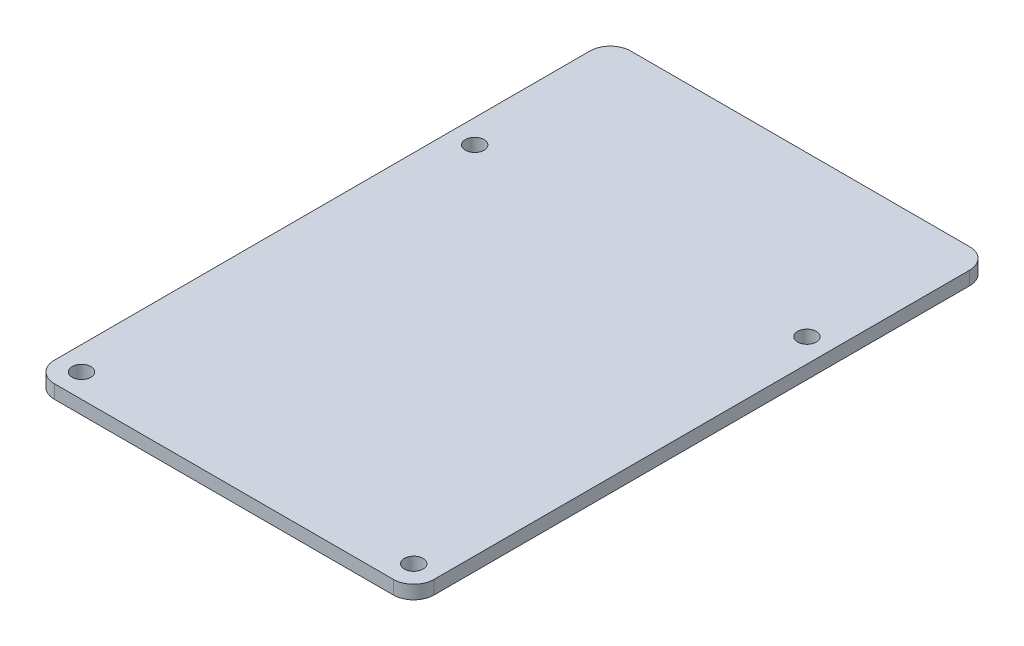
ISO-10303-21;
HEADER;
FILE_DESCRIPTION(('STEP AP214'),'2;1');
FILE_NAME('part.step','',(''),(''),'','','');
FILE_SCHEMA(('AUTOMOTIVE_DESIGN { 1 0 10303 214 1 1 1 1 }'));
ENDSEC;
DATA;
#1=APPLICATION_CONTEXT('core data for automotive mechanical design processes');
#2=APPLICATION_PROTOCOL_DEFINITION('international standard','automotive_design',2000,#1);
#3=PRODUCT_CONTEXT('',#1,'mechanical');
#4=PRODUCT('Part','Part','',(#3));
#5=PRODUCT_RELATED_PRODUCT_CATEGORY('part','',(#4));
#6=PRODUCT_DEFINITION_FORMATION('','',#4);
#7=PRODUCT_DEFINITION_CONTEXT('part definition',#1,'design');
#8=PRODUCT_DEFINITION('design','',#6,#7);
#9=PRODUCT_DEFINITION_SHAPE('','',#8);
#10=(LENGTH_UNIT() NAMED_UNIT(*) SI_UNIT(.MILLI.,.METRE.));
#11=(NAMED_UNIT(*) PLANE_ANGLE_UNIT() SI_UNIT($,.RADIAN.));
#12=(NAMED_UNIT(*) SI_UNIT($,.STERADIAN.) SOLID_ANGLE_UNIT());
#13=UNCERTAINTY_MEASURE_WITH_UNIT(LENGTH_MEASURE(1.E-05),#10,'distance_accuracy_value','');
#14=(GEOMETRIC_REPRESENTATION_CONTEXT(3) GLOBAL_UNCERTAINTY_ASSIGNED_CONTEXT((#13)) GLOBAL_UNIT_ASSIGNED_CONTEXT((#10,
#11,#12)) REPRESENTATION_CONTEXT('',''));
#15=CARTESIAN_POINT('',(0.,0.,0.));
#16=DIRECTION('',(0.,0.,1.));
#17=DIRECTION('',(1.,0.,0.));
#18=AXIS2_PLACEMENT_3D('',#15,#16,#17);
#19=CARTESIAN_POINT('',(0.,2.,0.));
#20=DIRECTION('',(0.,-1.,0.));
#21=DIRECTION('',(0.,0.,-1.));
#22=AXIS2_PLACEMENT_3D('',#19,#20,#21);
#23=PLANE('',#22);
#24=DIRECTION('',(-1.,0.,0.));
#25=VECTOR('',#24,1.);
#26=CARTESIAN_POINT('',(-28.,2.,-42.5));
#27=LINE('',#26,#25);
#28=CARTESIAN_POINT('',(25.,2.,-42.5));
#29=VERTEX_POINT('',#28);
#30=CARTESIAN_POINT('',(-25.,2.,-42.5));
#31=VERTEX_POINT('',#30);
#32=EDGE_CURVE('E169',#29,#31,#27,.T.);
#33=ORIENTED_EDGE('',*,*,#32,.T.);
#34=CARTESIAN_POINT('',(-25.,2.,-39.5));
#35=DIRECTION('',(0.,-1.,0.));
#36=DIRECTION('',(0.,0.,-1.));
#37=AXIS2_PLACEMENT_3D('',#34,#35,#36);
#38=CIRCLE('',#37,3.);
#39=CARTESIAN_POINT('',(-28.,2.,-39.5));
#40=VERTEX_POINT('',#39);
#41=EDGE_CURVE('E147',#31,#40,#38,.F.);
#42=ORIENTED_EDGE('',*,*,#41,.T.);
#43=DIRECTION('',(0.,0.,1.));
#44=VECTOR('',#43,1.);
#45=CARTESIAN_POINT('',(-28.,2.,42.5));
#46=LINE('',#45,#44);
#47=CARTESIAN_POINT('',(-28.,2.,39.5));
#48=VERTEX_POINT('',#47);
#49=EDGE_CURVE('E117',#40,#48,#46,.T.);
#50=ORIENTED_EDGE('',*,*,#49,.T.);
#51=CARTESIAN_POINT('',(-25.,2.,39.5));
#52=DIRECTION('',(0.,-1.,0.));
#53=DIRECTION('',(0.,0.,-1.));
#54=AXIS2_PLACEMENT_3D('',#51,#52,#53);
#55=CIRCLE('',#54,3.);
#56=CARTESIAN_POINT('',(-25.,2.,42.5));
#57=VERTEX_POINT('',#56);
#58=EDGE_CURVE('E53',#48,#57,#55,.F.);
#59=ORIENTED_EDGE('',*,*,#58,.T.);
#60=DIRECTION('',(1.,0.,0.));
#61=VECTOR('',#60,1.);
#62=CARTESIAN_POINT('',(-28.,2.,42.5));
#63=LINE('',#62,#61);
#64=CARTESIAN_POINT('',(25.,2.,42.5));
#65=VERTEX_POINT('',#64);
#66=EDGE_CURVE('E133',#57,#65,#63,.T.);
#67=ORIENTED_EDGE('',*,*,#66,.T.);
#68=CARTESIAN_POINT('',(25.,2.,39.5));
#69=DIRECTION('',(0.,-1.,0.));
#70=DIRECTION('',(0.,0.,-1.));
#71=AXIS2_PLACEMENT_3D('',#68,#69,#70);
#72=CIRCLE('',#71,3.);
#73=CARTESIAN_POINT('',(28.,2.,39.5));
#74=VERTEX_POINT('',#73);
#75=EDGE_CURVE('E143',#65,#74,#72,.F.);
#76=ORIENTED_EDGE('',*,*,#75,.T.);
#77=DIRECTION('',(0.,0.,-1.));
#78=VECTOR('',#77,1.);
#79=CARTESIAN_POINT('',(28.,2.,42.5));
#80=LINE('',#79,#78);
#81=CARTESIAN_POINT('',(28.,2.,-39.5));
#82=VERTEX_POINT('',#81);
#83=EDGE_CURVE('E127',#74,#82,#80,.T.);
#84=ORIENTED_EDGE('',*,*,#83,.T.);
#85=CARTESIAN_POINT('',(25.,2.,-39.5));
#86=DIRECTION('',(0.,-1.,0.));
#87=DIRECTION('',(0.,0.,-1.));
#88=AXIS2_PLACEMENT_3D('',#85,#86,#87);
#89=CIRCLE('',#88,3.);
#90=EDGE_CURVE('E145',#82,#29,#89,.F.);
#91=ORIENTED_EDGE('',*,*,#90,.T.);
#92=EDGE_LOOP('',(#33,#42,#50,#59,#67,#76,#84,#91));
#93=FACE_BOUND('',#92,.T.);
#94=CARTESIAN_POINT('',(-24.5,2.,39.));
#95=DIRECTION('',(0.,1.,0.));
#96=DIRECTION('',(0.,0.,1.));
#97=AXIS2_PLACEMENT_3D('',#94,#95,#96);
#98=CIRCLE('',#97,1.375);
#99=CARTESIAN_POINT('',(-24.5,2.,40.375));
#100=VERTEX_POINT('',#99);
#101=EDGE_CURVE('E178',#100,#100,#98,.T.);
#102=ORIENTED_EDGE('',*,*,#101,.F.);
#103=EDGE_LOOP('',(#102));
#104=FACE_BOUND('',#103,.T.);
#105=CARTESIAN_POINT('',(-24.5,2.,-19.));
#106=DIRECTION('',(0.,1.,0.));
#107=DIRECTION('',(0.,0.,1.));
#108=AXIS2_PLACEMENT_3D('',#105,#106,#107);
#109=CIRCLE('',#108,1.375);
#110=CARTESIAN_POINT('',(-24.5,2.,-17.625));
#111=VERTEX_POINT('',#110);
#112=EDGE_CURVE('E183',#111,#111,#109,.T.);
#113=ORIENTED_EDGE('',*,*,#112,.F.);
#114=EDGE_LOOP('',(#113));
#115=FACE_BOUND('',#114,.T.);
#116=CARTESIAN_POINT('',(24.5,2.,-19.));
#117=DIRECTION('',(0.,1.,0.));
#118=DIRECTION('',(0.,0.,1.));
#119=AXIS2_PLACEMENT_3D('',#116,#117,#118);
#120=CIRCLE('',#119,1.375);
#121=CARTESIAN_POINT('',(24.5,2.,-17.625));
#122=VERTEX_POINT('',#121);
#123=EDGE_CURVE('E188',#122,#122,#120,.T.);
#124=ORIENTED_EDGE('',*,*,#123,.F.);
#125=EDGE_LOOP('',(#124));
#126=FACE_BOUND('',#125,.T.);
#127=CARTESIAN_POINT('',(24.5,2.,39.));
#128=DIRECTION('',(0.,1.,0.));
#129=DIRECTION('',(0.,0.,1.));
#130=AXIS2_PLACEMENT_3D('',#127,#128,#129);
#131=CIRCLE('',#130,1.375);
#132=CARTESIAN_POINT('',(24.5,2.,40.375));
#133=VERTEX_POINT('',#132);
#134=EDGE_CURVE('E194',#133,#133,#131,.T.);
#135=ORIENTED_EDGE('',*,*,#134,.F.);
#136=EDGE_LOOP('',(#135));
#137=FACE_BOUND('',#136,.T.);
#138=ADVANCED_FACE('F33',(#93,#104,#115,#126,#137),#23,.F.);
#139=CARTESIAN_POINT('',(0.,0.,0.));
#140=DIRECTION('',(0.,-1.,0.));
#141=DIRECTION('',(0.,0.,-1.));
#142=AXIS2_PLACEMENT_3D('',#139,#140,#141);
#143=PLANE('',#142);
#144=CARTESIAN_POINT('',(24.5,0.,-19.));
#145=DIRECTION('',(0.,1.,0.));
#146=DIRECTION('',(0.,0.,1.));
#147=AXIS2_PLACEMENT_3D('',#144,#145,#146);
#148=CIRCLE('',#147,1.375);
#149=CARTESIAN_POINT('',(24.5,0.,-17.625));
#150=VERTEX_POINT('',#149);
#151=EDGE_CURVE('E191',#150,#150,#148,.T.);
#152=ORIENTED_EDGE('',*,*,#151,.T.);
#153=EDGE_LOOP('',(#152));
#154=FACE_BOUND('',#153,.T.);
#155=CARTESIAN_POINT('',(-24.5,0.,39.));
#156=DIRECTION('',(0.,1.,0.));
#157=DIRECTION('',(0.,0.,1.));
#158=AXIS2_PLACEMENT_3D('',#155,#156,#157);
#159=CIRCLE('',#158,1.375);
#160=CARTESIAN_POINT('',(-24.5,0.,40.375));
#161=VERTEX_POINT('',#160);
#162=EDGE_CURVE('E174',#161,#161,#159,.T.);
#163=ORIENTED_EDGE('',*,*,#162,.T.);
#164=EDGE_LOOP('',(#163));
#165=FACE_BOUND('',#164,.T.);
#166=DIRECTION('',(0.,0.,1.));
#167=VECTOR('',#166,1.);
#168=CARTESIAN_POINT('',(-28.,0.,42.5));
#169=LINE('',#168,#167);
#170=CARTESIAN_POINT('',(-28.,0.,-39.5));
#171=VERTEX_POINT('',#170);
#172=CARTESIAN_POINT('',(-28.,0.,39.5));
#173=VERTEX_POINT('',#172);
#174=EDGE_CURVE('E115',#171,#173,#169,.T.);
#175=ORIENTED_EDGE('',*,*,#174,.F.);
#176=CARTESIAN_POINT('',(-25.,0.,-39.5));
#177=DIRECTION('',(0.,-1.,0.));
#178=DIRECTION('',(0.,0.,-1.));
#179=AXIS2_PLACEMENT_3D('',#176,#177,#178);
#180=CIRCLE('',#179,3.);
#181=CARTESIAN_POINT('',(-25.,0.,-42.5));
#182=VERTEX_POINT('',#181);
#183=EDGE_CURVE('E98',#171,#182,#180,.T.);
#184=ORIENTED_EDGE('',*,*,#183,.T.);
#185=DIRECTION('',(-1.,0.,0.));
#186=VECTOR('',#185,1.);
#187=CARTESIAN_POINT('',(-28.,0.,-42.5));
#188=LINE('',#187,#186);
#189=CARTESIAN_POINT('',(25.,0.,-42.5));
#190=VERTEX_POINT('',#189);
#191=EDGE_CURVE('E125',#190,#182,#188,.T.);
#192=ORIENTED_EDGE('',*,*,#191,.F.);
#193=CARTESIAN_POINT('',(25.,0.,-39.5));
#194=DIRECTION('',(0.,-1.,0.));
#195=DIRECTION('',(0.,0.,-1.));
#196=AXIS2_PLACEMENT_3D('',#193,#194,#195);
#197=CIRCLE('',#196,3.);
#198=CARTESIAN_POINT('',(28.,0.,-39.5));
#199=VERTEX_POINT('',#198);
#200=EDGE_CURVE('E109',#190,#199,#197,.T.);
#201=ORIENTED_EDGE('',*,*,#200,.T.);
#202=DIRECTION('',(0.,0.,-1.));
#203=VECTOR('',#202,1.);
#204=CARTESIAN_POINT('',(28.,0.,42.5));
#205=LINE('',#204,#203);
#206=CARTESIAN_POINT('',(28.,0.,39.5));
#207=VERTEX_POINT('',#206);
#208=EDGE_CURVE('E129',#207,#199,#205,.T.);
#209=ORIENTED_EDGE('',*,*,#208,.F.);
#210=CARTESIAN_POINT('',(25.,0.,39.5));
#211=DIRECTION('',(0.,-1.,0.));
#212=DIRECTION('',(0.,0.,-1.));
#213=AXIS2_PLACEMENT_3D('',#210,#211,#212);
#214=CIRCLE('',#213,3.);
#215=CARTESIAN_POINT('',(25.,0.,42.5));
#216=VERTEX_POINT('',#215);
#217=EDGE_CURVE('E136',#207,#216,#214,.T.);
#218=ORIENTED_EDGE('',*,*,#217,.T.);
#219=DIRECTION('',(1.,0.,0.));
#220=VECTOR('',#219,1.);
#221=CARTESIAN_POINT('',(-28.,0.,42.5));
#222=LINE('',#221,#220);
#223=CARTESIAN_POINT('',(-25.,0.,42.5));
#224=VERTEX_POINT('',#223);
#225=EDGE_CURVE('E124',#224,#216,#222,.T.);
#226=ORIENTED_EDGE('',*,*,#225,.F.);
#227=CARTESIAN_POINT('',(-25.,0.,39.5));
#228=DIRECTION('',(0.,-1.,0.));
#229=DIRECTION('',(0.,0.,-1.));
#230=AXIS2_PLACEMENT_3D('',#227,#228,#229);
#231=CIRCLE('',#230,3.);
#232=EDGE_CURVE('E118',#224,#173,#231,.T.);
#233=ORIENTED_EDGE('',*,*,#232,.T.);
#234=EDGE_LOOP('',(#175,#184,#192,#201,#209,#218,#226,#233));
#235=FACE_BOUND('',#234,.T.);
#236=CARTESIAN_POINT('',(-24.5,0.,-19.));
#237=DIRECTION('',(0.,1.,0.));
#238=DIRECTION('',(0.,0.,1.));
#239=AXIS2_PLACEMENT_3D('',#236,#237,#238);
#240=CIRCLE('',#239,1.375);
#241=CARTESIAN_POINT('',(-24.5,0.,-17.625));
#242=VERTEX_POINT('',#241);
#243=EDGE_CURVE('E185',#242,#242,#240,.T.);
#244=ORIENTED_EDGE('',*,*,#243,.T.);
#245=EDGE_LOOP('',(#244));
#246=FACE_BOUND('',#245,.T.);
#247=CARTESIAN_POINT('',(24.5,0.,39.));
#248=DIRECTION('',(0.,1.,0.));
#249=DIRECTION('',(0.,0.,1.));
#250=AXIS2_PLACEMENT_3D('',#247,#248,#249);
#251=CIRCLE('',#250,1.375);
#252=CARTESIAN_POINT('',(24.5,0.,40.375));
#253=VERTEX_POINT('',#252);
#254=EDGE_CURVE('E197',#253,#253,#251,.T.);
#255=ORIENTED_EDGE('',*,*,#254,.T.);
#256=EDGE_LOOP('',(#255));
#257=FACE_BOUND('',#256,.T.);
#258=ADVANCED_FACE('F121',(#154,#165,#235,#246,#257),#143,.T.);
#259=CARTESIAN_POINT('',(28.,2.,42.5));
#260=DIRECTION('',(-1.,0.,0.));
#261=DIRECTION('',(0.,0.,1.));
#262=AXIS2_PLACEMENT_3D('',#259,#260,#261);
#263=PLANE('',#262);
#264=ORIENTED_EDGE('',*,*,#208,.T.);
#265=DIRECTION('',(0.,-1.,0.));
#266=VECTOR('',#265,1.);
#267=CARTESIAN_POINT('',(28.,2.,-39.5));
#268=LINE('',#267,#266);
#269=EDGE_CURVE('E152',#199,#82,#268,.F.);
#270=ORIENTED_EDGE('',*,*,#269,.T.);
#271=ORIENTED_EDGE('',*,*,#83,.F.);
#272=DIRECTION('',(0.,-1.,0.));
#273=VECTOR('',#272,1.);
#274=CARTESIAN_POINT('',(28.,2.,39.5));
#275=LINE('',#274,#273);
#276=EDGE_CURVE('E149',#74,#207,#275,.T.);
#277=ORIENTED_EDGE('',*,*,#276,.T.);
#278=EDGE_LOOP('',(#264,#270,#271,#277));
#279=FACE_BOUND('',#278,.T.);
#280=ADVANCED_FACE('F165',(#279),#263,.F.);
#281=CARTESIAN_POINT('',(-28.,2.,-42.5));
#282=DIRECTION('',(0.,0.,1.));
#283=DIRECTION('',(1.,0.,0.));
#284=AXIS2_PLACEMENT_3D('',#281,#282,#283);
#285=PLANE('',#284);
#286=ORIENTED_EDGE('',*,*,#191,.T.);
#287=DIRECTION('',(0.,-1.,0.));
#288=VECTOR('',#287,1.);
#289=CARTESIAN_POINT('',(-25.,2.,-42.5));
#290=LINE('',#289,#288);
#291=EDGE_CURVE('E103',#182,#31,#290,.F.);
#292=ORIENTED_EDGE('',*,*,#291,.T.);
#293=ORIENTED_EDGE('',*,*,#32,.F.);
#294=DIRECTION('',(0.,-1.,0.));
#295=VECTOR('',#294,1.);
#296=CARTESIAN_POINT('',(25.,2.,-42.5));
#297=LINE('',#296,#295);
#298=EDGE_CURVE('E108',#29,#190,#297,.T.);
#299=ORIENTED_EDGE('',*,*,#298,.T.);
#300=EDGE_LOOP('',(#286,#292,#293,#299));
#301=FACE_BOUND('',#300,.T.);
#302=ADVANCED_FACE('F223',(#301),#285,.F.);
#303=CARTESIAN_POINT('',(-28.,2.,42.5));
#304=DIRECTION('',(1.,0.,0.));
#305=DIRECTION('',(0.,0.,-1.));
#306=AXIS2_PLACEMENT_3D('',#303,#304,#305);
#307=PLANE('',#306);
#308=ORIENTED_EDGE('',*,*,#49,.F.);
#309=DIRECTION('',(0.,-1.,0.));
#310=VECTOR('',#309,1.);
#311=CARTESIAN_POINT('',(-28.,2.,-39.5));
#312=LINE('',#311,#310);
#313=EDGE_CURVE('E102',#40,#171,#312,.T.);
#314=ORIENTED_EDGE('',*,*,#313,.T.);
#315=ORIENTED_EDGE('',*,*,#174,.T.);
#316=DIRECTION('',(0.,-1.,0.));
#317=VECTOR('',#316,1.);
#318=CARTESIAN_POINT('',(-28.,2.,39.5));
#319=LINE('',#318,#317);
#320=EDGE_CURVE('E119',#173,#48,#319,.F.);
#321=ORIENTED_EDGE('',*,*,#320,.T.);
#322=EDGE_LOOP('',(#308,#314,#315,#321));
#323=FACE_BOUND('',#322,.T.);
#324=ADVANCED_FACE('F114',(#323),#307,.F.);
#325=CARTESIAN_POINT('',(-28.,2.,42.5));
#326=DIRECTION('',(0.,0.,-1.));
#327=DIRECTION('',(-1.,0.,0.));
#328=AXIS2_PLACEMENT_3D('',#325,#326,#327);
#329=PLANE('',#328);
#330=ORIENTED_EDGE('',*,*,#225,.T.);
#331=DIRECTION('',(0.,-1.,0.));
#332=VECTOR('',#331,1.);
#333=CARTESIAN_POINT('',(25.,2.,42.5));
#334=LINE('',#333,#332);
#335=EDGE_CURVE('E11',#216,#65,#334,.F.);
#336=ORIENTED_EDGE('',*,*,#335,.T.);
#337=ORIENTED_EDGE('',*,*,#66,.F.);
#338=DIRECTION('',(0.,-1.,0.));
#339=VECTOR('',#338,1.);
#340=CARTESIAN_POINT('',(-25.,2.,42.5));
#341=LINE('',#340,#339);
#342=EDGE_CURVE('E41',#57,#224,#341,.T.);
#343=ORIENTED_EDGE('',*,*,#342,.T.);
#344=EDGE_LOOP('',(#330,#336,#337,#343));
#345=FACE_BOUND('',#344,.T.);
#346=ADVANCED_FACE('F155',(#345),#329,.F.);
#347=CARTESIAN_POINT('',(-24.5,2.,39.));
#348=DIRECTION('',(0.,-1.,0.));
#349=DIRECTION('',(0.,0.,-1.));
#350=AXIS2_PLACEMENT_3D('',#347,#348,#349);
#351=CYLINDRICAL_SURFACE('',#350,1.375);
#352=ORIENTED_EDGE('',*,*,#101,.T.);
#353=EDGE_LOOP('',(#352));
#354=FACE_BOUND('',#353,.T.);
#355=ORIENTED_EDGE('',*,*,#162,.F.);
#356=EDGE_LOOP('',(#355));
#357=FACE_BOUND('',#356,.T.);
#358=ADVANCED_FACE('F216',(#354,#357),#351,.F.);
#359=CARTESIAN_POINT('',(-24.5,2.,-19.));
#360=DIRECTION('',(0.,-1.,0.));
#361=DIRECTION('',(0.,0.,-1.));
#362=AXIS2_PLACEMENT_3D('',#359,#360,#361);
#363=CYLINDRICAL_SURFACE('',#362,1.375);
#364=ORIENTED_EDGE('',*,*,#112,.T.);
#365=EDGE_LOOP('',(#364));
#366=FACE_BOUND('',#365,.T.);
#367=ORIENTED_EDGE('',*,*,#243,.F.);
#368=EDGE_LOOP('',(#367));
#369=FACE_BOUND('',#368,.T.);
#370=ADVANCED_FACE('F304',(#366,#369),#363,.F.);
#371=CARTESIAN_POINT('',(24.5,2.,-19.));
#372=DIRECTION('',(0.,-1.,0.));
#373=DIRECTION('',(0.,0.,-1.));
#374=AXIS2_PLACEMENT_3D('',#371,#372,#373);
#375=CYLINDRICAL_SURFACE('',#374,1.375);
#376=ORIENTED_EDGE('',*,*,#123,.T.);
#377=EDGE_LOOP('',(#376));
#378=FACE_BOUND('',#377,.T.);
#379=ORIENTED_EDGE('',*,*,#151,.F.);
#380=EDGE_LOOP('',(#379));
#381=FACE_BOUND('',#380,.T.);
#382=ADVANCED_FACE('F311',(#378,#381),#375,.F.);
#383=CARTESIAN_POINT('',(24.5,2.,39.));
#384=DIRECTION('',(0.,-1.,0.));
#385=DIRECTION('',(0.,0.,-1.));
#386=AXIS2_PLACEMENT_3D('',#383,#384,#385);
#387=CYLINDRICAL_SURFACE('',#386,1.375);
#388=ORIENTED_EDGE('',*,*,#134,.T.);
#389=EDGE_LOOP('',(#388));
#390=FACE_BOUND('',#389,.T.);
#391=ORIENTED_EDGE('',*,*,#254,.F.);
#392=EDGE_LOOP('',(#391));
#393=FACE_BOUND('',#392,.T.);
#394=ADVANCED_FACE('F203',(#390,#393),#387,.F.);
#395=CARTESIAN_POINT('',(-25.,2.,-39.5));
#396=DIRECTION('',(0.,-1.,0.));
#397=DIRECTION('',(0.,0.,-1.));
#398=AXIS2_PLACEMENT_3D('',#395,#396,#397);
#399=CYLINDRICAL_SURFACE('',#398,3.);
#400=ORIENTED_EDGE('',*,*,#41,.F.);
#401=ORIENTED_EDGE('',*,*,#291,.F.);
#402=ORIENTED_EDGE('',*,*,#183,.F.);
#403=ORIENTED_EDGE('',*,*,#313,.F.);
#404=EDGE_LOOP('',(#400,#401,#402,#403));
#405=FACE_BOUND('',#404,.T.);
#406=ADVANCED_FACE('F101',(#405),#399,.T.);
#407=CARTESIAN_POINT('',(25.,2.,-39.5));
#408=DIRECTION('',(0.,-1.,0.));
#409=DIRECTION('',(0.,0.,-1.));
#410=AXIS2_PLACEMENT_3D('',#407,#408,#409);
#411=CYLINDRICAL_SURFACE('',#410,3.);
#412=ORIENTED_EDGE('',*,*,#90,.F.);
#413=ORIENTED_EDGE('',*,*,#269,.F.);
#414=ORIENTED_EDGE('',*,*,#200,.F.);
#415=ORIENTED_EDGE('',*,*,#298,.F.);
#416=EDGE_LOOP('',(#412,#413,#414,#415));
#417=FACE_BOUND('',#416,.T.);
#418=ADVANCED_FACE('F231',(#417),#411,.T.);
#419=CARTESIAN_POINT('',(25.,2.,39.5));
#420=DIRECTION('',(0.,-1.,0.));
#421=DIRECTION('',(0.,0.,-1.));
#422=AXIS2_PLACEMENT_3D('',#419,#420,#421);
#423=CYLINDRICAL_SURFACE('',#422,3.);
#424=ORIENTED_EDGE('',*,*,#75,.F.);
#425=ORIENTED_EDGE('',*,*,#335,.F.);
#426=ORIENTED_EDGE('',*,*,#217,.F.);
#427=ORIENTED_EDGE('',*,*,#276,.F.);
#428=EDGE_LOOP('',(#424,#425,#426,#427));
#429=FACE_BOUND('',#428,.T.);
#430=ADVANCED_FACE('F162',(#429),#423,.T.);
#431=CARTESIAN_POINT('',(-25.,2.,39.5));
#432=DIRECTION('',(0.,-1.,0.));
#433=DIRECTION('',(0.,0.,-1.));
#434=AXIS2_PLACEMENT_3D('',#431,#432,#433);
#435=CYLINDRICAL_SURFACE('',#434,3.);
#436=ORIENTED_EDGE('',*,*,#58,.F.);
#437=ORIENTED_EDGE('',*,*,#320,.F.);
#438=ORIENTED_EDGE('',*,*,#232,.F.);
#439=ORIENTED_EDGE('',*,*,#342,.F.);
#440=EDGE_LOOP('',(#436,#437,#438,#439));
#441=FACE_BOUND('',#440,.T.);
#442=ADVANCED_FACE('F35',(#441),#435,.T.);
#443=CLOSED_SHELL('',(#138,#258,#280,#302,#324,#346,#358,#370,#382,#394,#406,#418,#430,#442));
#444=MANIFOLD_SOLID_BREP('B2',#443);
#445=ADVANCED_BREP_SHAPE_REPRESENTATION('',(#18,#444),#14);
#446=SHAPE_DEFINITION_REPRESENTATION(#9,#445);
ENDSEC;
END-ISO-10303-21;
